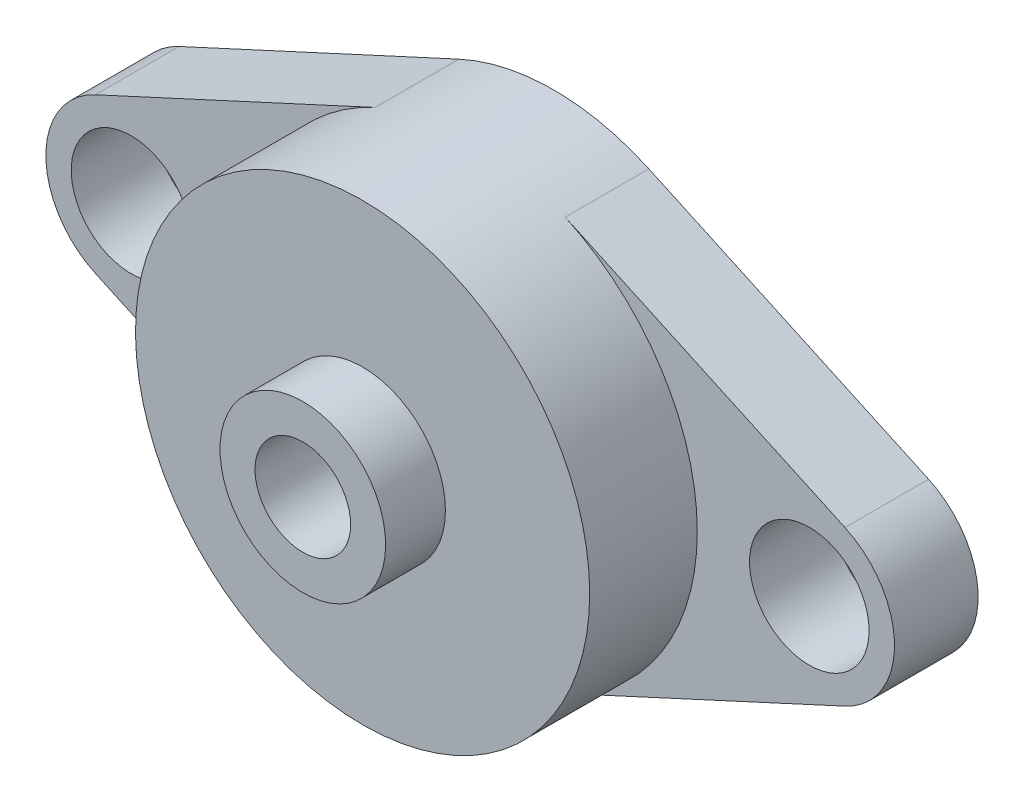
ISO-10303-21;
HEADER;
FILE_DESCRIPTION(('STEP AP214'),'2;1');
FILE_NAME('part.step','',(''),(''),'','','');
FILE_SCHEMA(('AUTOMOTIVE_DESIGN { 1 0 10303 214 1 1 1 1 }'));
ENDSEC;
DATA;
#1=APPLICATION_CONTEXT('core data for automotive mechanical design processes');
#2=APPLICATION_PROTOCOL_DEFINITION('international standard','automotive_design',2000,#1);
#3=PRODUCT_CONTEXT('',#1,'mechanical');
#4=PRODUCT('Part','Part','',(#3));
#5=PRODUCT_RELATED_PRODUCT_CATEGORY('part','',(#4));
#6=PRODUCT_DEFINITION_FORMATION('','',#4);
#7=PRODUCT_DEFINITION_CONTEXT('part definition',#1,'design');
#8=PRODUCT_DEFINITION('design','',#6,#7);
#9=PRODUCT_DEFINITION_SHAPE('','',#8);
#10=(LENGTH_UNIT() NAMED_UNIT(*) SI_UNIT(.MILLI.,.METRE.));
#11=(NAMED_UNIT(*) PLANE_ANGLE_UNIT() SI_UNIT($,.RADIAN.));
#12=(NAMED_UNIT(*) SI_UNIT($,.STERADIAN.) SOLID_ANGLE_UNIT());
#13=UNCERTAINTY_MEASURE_WITH_UNIT(LENGTH_MEASURE(1.E-05),#10,'distance_accuracy_value','');
#14=(GEOMETRIC_REPRESENTATION_CONTEXT(3) GLOBAL_UNCERTAINTY_ASSIGNED_CONTEXT((#13)) GLOBAL_UNIT_ASSIGNED_CONTEXT((#10,
#11,#12)) REPRESENTATION_CONTEXT('',''));
#15=CARTESIAN_POINT('',(0.,0.,0.));
#16=DIRECTION('',(0.,0.,1.));
#17=DIRECTION('',(1.,0.,0.));
#18=AXIS2_PLACEMENT_3D('',#15,#16,#17);
#19=CARTESIAN_POINT('',(-45.0453125,0.,5.55625));
#20=DIRECTION('',(0.,0.,1.));
#21=DIRECTION('',(1.,0.,0.));
#22=AXIS2_PLACEMENT_3D('',#19,#20,#21);
#23=PLANE('',#22);
#24=CARTESIAN_POINT('',(0.,0.,5.55625));
#25=DIRECTION('',(0.,0.,1.));
#26=DIRECTION('',(1.,0.,0.));
#27=AXIS2_PLACEMENT_3D('',#24,#25,#26);
#28=CIRCLE('',#27,30.1625);
#29=CARTESIAN_POINT('',(-12.6230726872247,27.3940585197419,5.55625));
#30=VERTEX_POINT('',#29);
#31=CARTESIAN_POINT('',(-12.6230726872247,-27.3940585197419,5.55625));
#32=VERTEX_POINT('',#31);
#33=EDGE_CURVE('E142',#30,#32,#28,.T.);
#34=ORIENTED_EDGE('',*,*,#33,.F.);
#35=DIRECTION('',(0.908215781839764,0.418502202643172,0.));
#36=VECTOR('',#35,1.);
#37=CARTESIAN_POINT('',(-49.7789647577093,10.2727719449032,5.55625));
#38=LINE('',#37,#36);
#39=CARTESIAN_POINT('',(-49.7789647577093,10.2727719449032,5.55625));
#40=VERTEX_POINT('',#39);
#41=EDGE_CURVE('E232',#40,#30,#38,.T.);
#42=ORIENTED_EDGE('',*,*,#41,.F.);
#43=CARTESIAN_POINT('',(-45.0453125,0.,5.55625));
#44=DIRECTION('',(0.,0.,1.));
#45=DIRECTION('',(1.,0.,0.));
#46=AXIS2_PLACEMENT_3D('',#43,#44,#45);
#47=CIRCLE('',#46,11.3109375);
#48=CARTESIAN_POINT('',(-49.7789647577093,-10.2727719449032,5.55625));
#49=VERTEX_POINT('',#48);
#50=EDGE_CURVE('E254',#40,#49,#47,.T.);
#51=ORIENTED_EDGE('',*,*,#50,.T.);
#52=DIRECTION('',(0.908215781839764,-0.418502202643172,0.));
#53=VECTOR('',#52,1.);
#54=CARTESIAN_POINT('',(-49.7789647577093,-10.2727719449032,5.55625));
#55=LINE('',#54,#53);
#56=EDGE_CURVE('E195',#49,#32,#55,.T.);
#57=ORIENTED_EDGE('',*,*,#56,.T.);
#58=EDGE_LOOP('',(#34,#42,#51,#57));
#59=FACE_BOUND('',#58,.T.);
#60=CARTESIAN_POINT('',(-45.0453125,0.,5.55625));
#61=DIRECTION('',(0.,0.,1.));
#62=DIRECTION('',(1.,0.,0.));
#63=AXIS2_PLACEMENT_3D('',#60,#61,#62);
#64=CIRCLE('',#63,7.9375);
#65=CARTESIAN_POINT('',(-37.1078125,0.,5.55625));
#66=VERTEX_POINT('',#65);
#67=EDGE_CURVE('E239',#66,#66,#64,.T.);
#68=ORIENTED_EDGE('',*,*,#67,.F.);
#69=EDGE_LOOP('',(#68));
#70=FACE_BOUND('',#69,.T.);
#71=ADVANCED_FACE('F135',(#59,#70),#23,.T.);
#72=CARTESIAN_POINT('',(12.6230726872247,-27.3940585197419,5.55625));
#73=VERTEX_POINT('',#72);
#74=CARTESIAN_POINT('',(12.6230726872247,27.3940585197419,5.55625));
#75=VERTEX_POINT('',#74);
#76=EDGE_CURVE('E266',#73,#75,#28,.T.);
#77=ORIENTED_EDGE('',*,*,#76,.F.);
#78=DIRECTION('',(-0.908215781839764,-0.418502202643172,0.));
#79=VECTOR('',#78,1.);
#80=CARTESIAN_POINT('',(49.7789647577093,-10.2727719449032,5.55625));
#81=LINE('',#80,#79);
#82=CARTESIAN_POINT('',(49.7789647577093,-10.2727719449032,5.55625));
#83=VERTEX_POINT('',#82);
#84=EDGE_CURVE('E230',#83,#73,#81,.T.);
#85=ORIENTED_EDGE('',*,*,#84,.F.);
#86=CARTESIAN_POINT('',(45.0453125,0.,5.55625));
#87=DIRECTION('',(0.,0.,-1.));
#88=DIRECTION('',(-1.,0.,0.));
#89=AXIS2_PLACEMENT_3D('',#86,#87,#88);
#90=CIRCLE('',#89,11.3109375);
#91=CARTESIAN_POINT('',(49.7789647577093,10.2727719449032,5.55625));
#92=VERTEX_POINT('',#91);
#93=EDGE_CURVE('E207',#92,#83,#90,.T.);
#94=ORIENTED_EDGE('',*,*,#93,.F.);
#95=DIRECTION('',(0.908215781839764,-0.418502202643172,0.));
#96=VECTOR('',#95,1.);
#97=CARTESIAN_POINT('',(12.6230726872247,27.3940585197419,5.55625));
#98=LINE('',#97,#96);
#99=EDGE_CURVE('E221',#75,#92,#98,.T.);
#100=ORIENTED_EDGE('',*,*,#99,.F.);
#101=EDGE_LOOP('',(#77,#85,#94,#100));
#102=FACE_BOUND('',#101,.T.);
#103=CARTESIAN_POINT('',(45.0453125,0.,5.55625));
#104=DIRECTION('',(0.,0.,1.));
#105=DIRECTION('',(1.,0.,0.));
#106=AXIS2_PLACEMENT_3D('',#103,#104,#105);
#107=CIRCLE('',#106,7.9375);
#108=CARTESIAN_POINT('',(52.9828125,0.,5.55625));
#109=VERTEX_POINT('',#108);
#110=EDGE_CURVE('E272',#109,#109,#107,.T.);
#111=ORIENTED_EDGE('',*,*,#110,.F.);
#112=EDGE_LOOP('',(#111));
#113=FACE_BOUND('',#112,.T.);
#114=ADVANCED_FACE('F225',(#102,#113),#23,.T.);
#115=CARTESIAN_POINT('',(-45.0453125,0.,-5.55625));
#116=DIRECTION('',(0.,0.,1.));
#117=DIRECTION('',(1.,0.,0.));
#118=AXIS2_PLACEMENT_3D('',#115,#116,#117);
#119=PLANE('',#118);
#120=CARTESIAN_POINT('',(-45.0453125,0.,-5.55625));
#121=DIRECTION('',(0.,0.,1.));
#122=DIRECTION('',(1.,0.,0.));
#123=AXIS2_PLACEMENT_3D('',#120,#121,#122);
#124=CIRCLE('',#123,11.3109375);
#125=CARTESIAN_POINT('',(-49.7789647577093,10.2727719449032,-5.55625));
#126=VERTEX_POINT('',#125);
#127=CARTESIAN_POINT('',(-49.7789647577093,-10.2727719449032,-5.55625));
#128=VERTEX_POINT('',#127);
#129=EDGE_CURVE('E237',#126,#128,#124,.T.);
#130=ORIENTED_EDGE('',*,*,#129,.F.);
#131=DIRECTION('',(0.908215781839764,0.418502202643172,0.));
#132=VECTOR('',#131,1.);
#133=CARTESIAN_POINT('',(-49.7789647577093,10.2727719449032,-5.55625));
#134=LINE('',#133,#132);
#135=CARTESIAN_POINT('',(-12.6230726872247,27.3940585197419,-5.55625));
#136=VERTEX_POINT('',#135);
#137=EDGE_CURVE('E252',#126,#136,#134,.T.);
#138=ORIENTED_EDGE('',*,*,#137,.T.);
#139=CARTESIAN_POINT('',(0.,0.,-5.55625));
#140=DIRECTION('',(0.,0.,1.));
#141=DIRECTION('',(1.,0.,0.));
#142=AXIS2_PLACEMENT_3D('',#139,#140,#141);
#143=CIRCLE('',#142,30.1625);
#144=CARTESIAN_POINT('',(12.6230726872247,27.3940585197419,-5.55625));
#145=VERTEX_POINT('',#144);
#146=EDGE_CURVE('E246',#145,#136,#143,.T.);
#147=ORIENTED_EDGE('',*,*,#146,.F.);
#148=DIRECTION('',(0.908215781839764,-0.418502202643172,0.));
#149=VECTOR('',#148,1.);
#150=CARTESIAN_POINT('',(12.6230726872247,27.3940585197419,-5.55625));
#151=LINE('',#150,#149);
#152=CARTESIAN_POINT('',(49.7789647577093,10.2727719449032,-5.55625));
#153=VERTEX_POINT('',#152);
#154=EDGE_CURVE('E248',#145,#153,#151,.T.);
#155=ORIENTED_EDGE('',*,*,#154,.T.);
#156=CARTESIAN_POINT('',(45.0453125,0.,-5.55625));
#157=DIRECTION('',(0.,0.,-1.));
#158=DIRECTION('',(-1.,0.,0.));
#159=AXIS2_PLACEMENT_3D('',#156,#157,#158);
#160=CIRCLE('',#159,11.3109375);
#161=CARTESIAN_POINT('',(49.7789647577093,-10.2727719449032,-5.55625));
#162=VERTEX_POINT('',#161);
#163=EDGE_CURVE('E211',#153,#162,#160,.T.);
#164=ORIENTED_EDGE('',*,*,#163,.T.);
#165=DIRECTION('',(-0.908215781839764,-0.418502202643172,0.));
#166=VECTOR('',#165,1.);
#167=CARTESIAN_POINT('',(49.7789647577093,-10.2727719449032,-5.55625));
#168=LINE('',#167,#166);
#169=CARTESIAN_POINT('',(12.6230726872247,-27.3940585197419,-5.55625));
#170=VERTEX_POINT('',#169);
#171=EDGE_CURVE('E241',#162,#170,#168,.T.);
#172=ORIENTED_EDGE('',*,*,#171,.T.);
#173=CARTESIAN_POINT('',(0.,0.,-5.55625));
#174=DIRECTION('',(0.,0.,1.));
#175=DIRECTION('',(1.,0.,0.));
#176=AXIS2_PLACEMENT_3D('',#173,#174,#175);
#177=CIRCLE('',#176,30.1625);
#178=CARTESIAN_POINT('',(-12.6230726872247,-27.3940585197419,-5.55625));
#179=VERTEX_POINT('',#178);
#180=EDGE_CURVE('E242',#179,#170,#177,.T.);
#181=ORIENTED_EDGE('',*,*,#180,.F.);
#182=DIRECTION('',(0.908215781839764,-0.418502202643172,0.));
#183=VECTOR('',#182,1.);
#184=CARTESIAN_POINT('',(-49.7789647577093,-10.2727719449032,-5.55625));
#185=LINE('',#184,#183);
#186=EDGE_CURVE('E236',#128,#179,#185,.T.);
#187=ORIENTED_EDGE('',*,*,#186,.F.);
#188=EDGE_LOOP('',(#130,#138,#147,#155,#164,#172,#181,#187));
#189=FACE_BOUND('',#188,.T.);
#190=CARTESIAN_POINT('',(-45.0453125,0.,-5.55625));
#191=DIRECTION('',(0.,0.,1.));
#192=DIRECTION('',(1.,0.,0.));
#193=AXIS2_PLACEMENT_3D('',#190,#191,#192);
#194=CIRCLE('',#193,7.9375);
#195=CARTESIAN_POINT('',(-37.1078125,0.,-5.55625));
#196=VERTEX_POINT('',#195);
#197=EDGE_CURVE('E285',#196,#196,#194,.T.);
#198=ORIENTED_EDGE('',*,*,#197,.T.);
#199=EDGE_LOOP('',(#198));
#200=FACE_BOUND('',#199,.T.);
#201=CARTESIAN_POINT('',(0.,0.,-5.55625));
#202=DIRECTION('',(0.,0.,1.));
#203=DIRECTION('',(1.,0.,0.));
#204=AXIS2_PLACEMENT_3D('',#201,#202,#203);
#205=CIRCLE('',#204,6.35);
#206=CARTESIAN_POINT('',(6.35,0.,-5.55625));
#207=VERTEX_POINT('',#206);
#208=EDGE_CURVE('E277',#207,#207,#205,.T.);
#209=ORIENTED_EDGE('',*,*,#208,.T.);
#210=EDGE_LOOP('',(#209));
#211=FACE_BOUND('',#210,.T.);
#212=CARTESIAN_POINT('',(45.0453125,0.,-5.55625));
#213=DIRECTION('',(0.,0.,1.));
#214=DIRECTION('',(1.,0.,0.));
#215=AXIS2_PLACEMENT_3D('',#212,#213,#214);
#216=CIRCLE('',#215,7.9375);
#217=CARTESIAN_POINT('',(52.9828125,0.,-5.55625));
#218=VERTEX_POINT('',#217);
#219=EDGE_CURVE('E280',#218,#218,#216,.T.);
#220=ORIENTED_EDGE('',*,*,#219,.T.);
#221=EDGE_LOOP('',(#220));
#222=FACE_BOUND('',#221,.T.);
#223=ADVANCED_FACE('F295',(#189,#200,#211,#222),#119,.F.);
#224=CARTESIAN_POINT('',(-45.0453125,0.,5.55625));
#225=DIRECTION('',(0.,0.,-1.));
#226=DIRECTION('',(-1.,0.,0.));
#227=AXIS2_PLACEMENT_3D('',#224,#225,#226);
#228=CYLINDRICAL_SURFACE('',#227,11.3109375);
#229=ORIENTED_EDGE('',*,*,#129,.T.);
#230=DIRECTION('',(0.,0.,-1.));
#231=VECTOR('',#230,1.);
#232=CARTESIAN_POINT('',(-49.7789647577093,-10.2727719449032,5.55625));
#233=LINE('',#232,#231);
#234=EDGE_CURVE('E137',#49,#128,#233,.T.);
#235=ORIENTED_EDGE('',*,*,#234,.F.);
#236=ORIENTED_EDGE('',*,*,#50,.F.);
#237=DIRECTION('',(0.,0.,-1.));
#238=VECTOR('',#237,1.);
#239=CARTESIAN_POINT('',(-49.7789647577093,10.2727719449032,5.55625));
#240=LINE('',#239,#238);
#241=EDGE_CURVE('E151',#40,#126,#240,.T.);
#242=ORIENTED_EDGE('',*,*,#241,.T.);
#243=EDGE_LOOP('',(#229,#235,#236,#242));
#244=FACE_BOUND('',#243,.T.);
#245=ADVANCED_FACE('F131',(#244),#228,.T.);
#246=CARTESIAN_POINT('',(-49.7789647577093,-10.2727719449032,5.55625));
#247=DIRECTION('',(0.418502202643172,0.908215781839764,0.));
#248=DIRECTION('',(-0.908215781839764,0.418502202643172,0.));
#249=AXIS2_PLACEMENT_3D('',#246,#247,#248);
#250=PLANE('',#249);
#251=ORIENTED_EDGE('',*,*,#186,.T.);
#252=DIRECTION('',(0.,0.,-1.));
#253=VECTOR('',#252,1.);
#254=CARTESIAN_POINT('',(-12.6230726872247,-27.3940585197419,5.55625));
#255=LINE('',#254,#253);
#256=EDGE_CURVE('E261',#32,#179,#255,.T.);
#257=ORIENTED_EDGE('',*,*,#256,.F.);
#258=ORIENTED_EDGE('',*,*,#56,.F.);
#259=ORIENTED_EDGE('',*,*,#234,.T.);
#260=EDGE_LOOP('',(#251,#257,#258,#259));
#261=FACE_BOUND('',#260,.T.);
#262=ADVANCED_FACE('F302',(#261),#250,.F.);
#263=CARTESIAN_POINT('',(49.7789647577093,-10.2727719449032,5.55625));
#264=DIRECTION('',(0.418502202643172,-0.908215781839764,0.));
#265=DIRECTION('',(0.908215781839764,0.418502202643172,0.));
#266=AXIS2_PLACEMENT_3D('',#263,#264,#265);
#267=PLANE('',#266);
#268=ORIENTED_EDGE('',*,*,#171,.F.);
#269=DIRECTION('',(0.,0.,-1.));
#270=VECTOR('',#269,1.);
#271=CARTESIAN_POINT('',(49.7789647577093,-10.2727719449032,5.55625));
#272=LINE('',#271,#270);
#273=EDGE_CURVE('E216',#83,#162,#272,.T.);
#274=ORIENTED_EDGE('',*,*,#273,.F.);
#275=ORIENTED_EDGE('',*,*,#84,.T.);
#276=DIRECTION('',(0.,0.,-1.));
#277=VECTOR('',#276,1.);
#278=CARTESIAN_POINT('',(12.6230726872247,-27.3940585197419,5.55625));
#279=LINE('',#278,#277);
#280=EDGE_CURVE('E257',#73,#170,#279,.T.);
#281=ORIENTED_EDGE('',*,*,#280,.T.);
#282=EDGE_LOOP('',(#268,#274,#275,#281));
#283=FACE_BOUND('',#282,.T.);
#284=ADVANCED_FACE('F286',(#283),#267,.T.);
#285=CARTESIAN_POINT('',(45.0453125,0.,5.55625));
#286=DIRECTION('',(0.,0.,-1.));
#287=DIRECTION('',(-1.,0.,0.));
#288=AXIS2_PLACEMENT_3D('',#285,#286,#287);
#289=CYLINDRICAL_SURFACE('',#288,11.3109375);
#290=ORIENTED_EDGE('',*,*,#163,.F.);
#291=DIRECTION('',(0.,0.,-1.));
#292=VECTOR('',#291,1.);
#293=CARTESIAN_POINT('',(49.7789647577093,10.2727719449032,5.55625));
#294=LINE('',#293,#292);
#295=EDGE_CURVE('E206',#92,#153,#294,.T.);
#296=ORIENTED_EDGE('',*,*,#295,.F.);
#297=ORIENTED_EDGE('',*,*,#93,.T.);
#298=ORIENTED_EDGE('',*,*,#273,.T.);
#299=EDGE_LOOP('',(#290,#296,#297,#298));
#300=FACE_BOUND('',#299,.T.);
#301=ADVANCED_FACE('F208',(#300),#289,.T.);
#302=CARTESIAN_POINT('',(12.6230726872247,27.3940585197419,5.55625));
#303=DIRECTION('',(0.418502202643172,0.908215781839764,0.));
#304=DIRECTION('',(-0.908215781839764,0.418502202643172,0.));
#305=AXIS2_PLACEMENT_3D('',#302,#303,#304);
#306=PLANE('',#305);
#307=ORIENTED_EDGE('',*,*,#154,.F.);
#308=DIRECTION('',(0.,0.,-1.));
#309=VECTOR('',#308,1.);
#310=CARTESIAN_POINT('',(12.6230726872247,27.3940585197419,5.55625));
#311=LINE('',#310,#309);
#312=EDGE_CURVE('E220',#75,#145,#311,.T.);
#313=ORIENTED_EDGE('',*,*,#312,.F.);
#314=ORIENTED_EDGE('',*,*,#99,.T.);
#315=ORIENTED_EDGE('',*,*,#295,.T.);
#316=EDGE_LOOP('',(#307,#313,#314,#315));
#317=FACE_BOUND('',#316,.T.);
#318=ADVANCED_FACE('F226',(#317),#306,.T.);
#319=CARTESIAN_POINT('',(0.,0.,5.55625));
#320=DIRECTION('',(0.,0.,-1.));
#321=DIRECTION('',(-1.,0.,0.));
#322=AXIS2_PLACEMENT_3D('',#319,#320,#321);
#323=CYLINDRICAL_SURFACE('',#322,30.1625);
#324=ORIENTED_EDGE('',*,*,#146,.T.);
#325=DIRECTION('',(0.,0.,-1.));
#326=VECTOR('',#325,1.);
#327=CARTESIAN_POINT('',(-12.6230726872247,27.3940585197419,5.55625));
#328=LINE('',#327,#326);
#329=EDGE_CURVE('E179',#30,#136,#328,.T.);
#330=ORIENTED_EDGE('',*,*,#329,.F.);
#331=ORIENTED_EDGE('',*,*,#33,.T.);
#332=ORIENTED_EDGE('',*,*,#256,.T.);
#333=ORIENTED_EDGE('',*,*,#180,.T.);
#334=ORIENTED_EDGE('',*,*,#280,.F.);
#335=ORIENTED_EDGE('',*,*,#76,.T.);
#336=ORIENTED_EDGE('',*,*,#312,.T.);
#337=EDGE_LOOP('',(#324,#330,#331,#332,#333,#334,#335,#336));
#338=FACE_BOUND('',#337,.T.);
#339=CARTESIAN_POINT('',(0.,0.,19.84375));
#340=DIRECTION('',(0.,0.,1.));
#341=DIRECTION('',(1.,0.,0.));
#342=AXIS2_PLACEMENT_3D('',#339,#340,#341);
#343=CIRCLE('',#342,30.1625);
#344=CARTESIAN_POINT('',(30.1625,0.,19.84375));
#345=VERTEX_POINT('',#344);
#346=EDGE_CURVE('E275',#345,#345,#343,.T.);
#347=ORIENTED_EDGE('',*,*,#346,.F.);
#348=EDGE_LOOP('',(#347));
#349=FACE_BOUND('',#348,.T.);
#350=ADVANCED_FACE('F293',(#338,#349),#323,.T.);
#351=CARTESIAN_POINT('',(-49.7789647577093,10.2727719449032,5.55625));
#352=DIRECTION('',(-0.418502202643172,0.908215781839764,0.));
#353=DIRECTION('',(-0.908215781839764,-0.418502202643172,0.));
#354=AXIS2_PLACEMENT_3D('',#351,#352,#353);
#355=PLANE('',#354);
#356=ORIENTED_EDGE('',*,*,#137,.F.);
#357=ORIENTED_EDGE('',*,*,#241,.F.);
#358=ORIENTED_EDGE('',*,*,#41,.T.);
#359=ORIENTED_EDGE('',*,*,#329,.T.);
#360=EDGE_LOOP('',(#356,#357,#358,#359));
#361=FACE_BOUND('',#360,.T.);
#362=ADVANCED_FACE('F299',(#361),#355,.T.);
#363=CARTESIAN_POINT('',(-45.0453125,0.,5.55625));
#364=DIRECTION('',(0.,0.,-1.));
#365=DIRECTION('',(-1.,0.,0.));
#366=AXIS2_PLACEMENT_3D('',#363,#364,#365);
#367=CYLINDRICAL_SURFACE('',#366,7.9375);
#368=ORIENTED_EDGE('',*,*,#67,.T.);
#369=EDGE_LOOP('',(#368));
#370=FACE_BOUND('',#369,.T.);
#371=ORIENTED_EDGE('',*,*,#197,.F.);
#372=EDGE_LOOP('',(#371));
#373=FACE_BOUND('',#372,.T.);
#374=ADVANCED_FACE('F316',(#370,#373),#367,.F.);
#375=CARTESIAN_POINT('',(0.,0.,5.55625));
#376=DIRECTION('',(0.,0.,-1.));
#377=DIRECTION('',(-1.,0.,0.));
#378=AXIS2_PLACEMENT_3D('',#375,#376,#377);
#379=CYLINDRICAL_SURFACE('',#378,6.35);
#380=ORIENTED_EDGE('',*,*,#208,.F.);
#381=EDGE_LOOP('',(#380));
#382=FACE_BOUND('',#381,.T.);
#383=CARTESIAN_POINT('',(0.,0.,27.78125));
#384=DIRECTION('',(0.,0.,1.));
#385=DIRECTION('',(1.,0.,0.));
#386=AXIS2_PLACEMENT_3D('',#383,#384,#385);
#387=CIRCLE('',#386,6.35);
#388=CARTESIAN_POINT('',(6.35,0.,27.78125));
#389=VERTEX_POINT('',#388);
#390=EDGE_CURVE('E478',#389,#389,#387,.F.);
#391=ORIENTED_EDGE('',*,*,#390,.F.);
#392=EDGE_LOOP('',(#391));
#393=FACE_BOUND('',#392,.T.);
#394=ADVANCED_FACE('F349',(#382,#393),#379,.F.);
#395=CARTESIAN_POINT('',(45.0453125,0.,5.55625));
#396=DIRECTION('',(0.,0.,-1.));
#397=DIRECTION('',(-1.,0.,0.));
#398=AXIS2_PLACEMENT_3D('',#395,#396,#397);
#399=CYLINDRICAL_SURFACE('',#398,7.9375);
#400=ORIENTED_EDGE('',*,*,#110,.T.);
#401=EDGE_LOOP('',(#400));
#402=FACE_BOUND('',#401,.T.);
#403=ORIENTED_EDGE('',*,*,#219,.F.);
#404=EDGE_LOOP('',(#403));
#405=FACE_BOUND('',#404,.T.);
#406=ADVANCED_FACE('F354',(#402,#405),#399,.F.);
#407=CARTESIAN_POINT('',(0.,0.,19.84375));
#408=DIRECTION('',(0.,0.,1.));
#409=DIRECTION('',(1.,0.,0.));
#410=AXIS2_PLACEMENT_3D('',#407,#408,#409);
#411=PLANE('',#410);
#412=CARTESIAN_POINT('',(0.,0.,19.84375));
#413=DIRECTION('',(0.,0.,1.));
#414=DIRECTION('',(1.,0.,0.));
#415=AXIS2_PLACEMENT_3D('',#412,#413,#414);
#416=CIRCLE('',#415,11.);
#417=CARTESIAN_POINT('',(11.,0.,19.84375));
#418=VERTEX_POINT('',#417);
#419=EDGE_CURVE('E12',#418,#418,#416,.T.);
#420=ORIENTED_EDGE('',*,*,#419,.F.);
#421=EDGE_LOOP('',(#420));
#422=FACE_BOUND('',#421,.T.);
#423=ORIENTED_EDGE('',*,*,#346,.T.);
#424=EDGE_LOOP('',(#423));
#425=FACE_BOUND('',#424,.T.);
#426=ADVANCED_FACE('F359',(#422,#425),#411,.T.);
#427=CARTESIAN_POINT('',(0.,0.,27.78125));
#428=DIRECTION('',(0.,0.,-1.));
#429=DIRECTION('',(-1.,0.,0.));
#430=AXIS2_PLACEMENT_3D('',#427,#428,#429);
#431=CYLINDRICAL_SURFACE('',#430,11.);
#432=CARTESIAN_POINT('',(0.,0.,27.78125));
#433=DIRECTION('',(0.,0.,1.));
#434=DIRECTION('',(1.,0.,0.));
#435=AXIS2_PLACEMENT_3D('',#432,#433,#434);
#436=CIRCLE('',#435,11.);
#437=CARTESIAN_POINT('',(11.,0.,27.78125));
#438=VERTEX_POINT('',#437);
#439=EDGE_CURVE('E480',#438,#438,#436,.T.);
#440=ORIENTED_EDGE('',*,*,#439,.F.);
#441=EDGE_LOOP('',(#440));
#442=FACE_BOUND('',#441,.T.);
#443=ORIENTED_EDGE('',*,*,#419,.T.);
#444=EDGE_LOOP('',(#443));
#445=FACE_BOUND('',#444,.T.);
#446=ADVANCED_FACE('F361',(#442,#445),#431,.T.);
#447=CARTESIAN_POINT('',(0.,0.,27.78125));
#448=DIRECTION('',(0.,0.,1.));
#449=DIRECTION('',(1.,0.,0.));
#450=AXIS2_PLACEMENT_3D('',#447,#448,#449);
#451=PLANE('',#450);
#452=ORIENTED_EDGE('',*,*,#390,.T.);
#453=EDGE_LOOP('',(#452));
#454=FACE_BOUND('',#453,.T.);
#455=ORIENTED_EDGE('',*,*,#439,.T.);
#456=EDGE_LOOP('',(#455));
#457=FACE_BOUND('',#456,.T.);
#458=ADVANCED_FACE('F375',(#454,#457),#451,.T.);
#459=CLOSED_SHELL('',(#71,#114,#223,#245,#262,#284,#301,#318,#350,#362,#374,#394,#406,#426,#446,#458));
#460=MANIFOLD_SOLID_BREP('B2',#459);
#461=ADVANCED_BREP_SHAPE_REPRESENTATION('',(#18,#460),#14);
#462=SHAPE_DEFINITION_REPRESENTATION(#9,#461);
ENDSEC;
END-ISO-10303-21;
